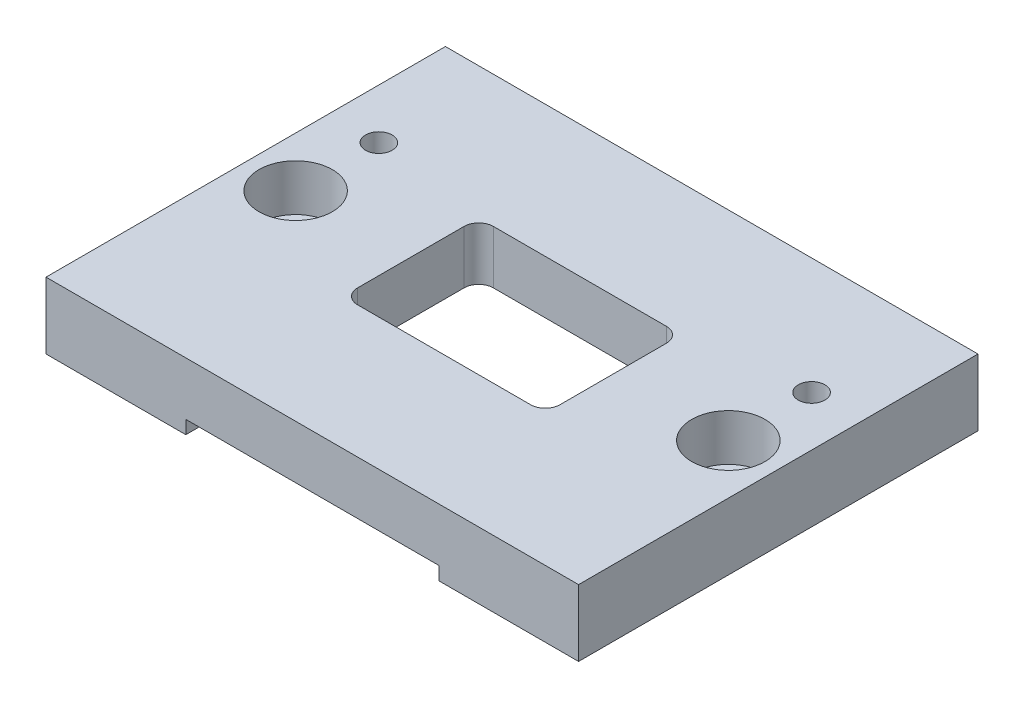
ISO-10303-21;
HEADER;
FILE_DESCRIPTION(('STEP AP214'),'2;1');
FILE_NAME('part.step','',(''),(''),'','','');
FILE_SCHEMA(('AUTOMOTIVE_DESIGN { 1 0 10303 214 1 1 1 1 }'));
ENDSEC;
DATA;
#1=APPLICATION_CONTEXT('core data for automotive mechanical design processes');
#2=APPLICATION_PROTOCOL_DEFINITION('international standard','automotive_design',2000,#1);
#3=PRODUCT_CONTEXT('',#1,'mechanical');
#4=PRODUCT('Part','Part','',(#3));
#5=PRODUCT_RELATED_PRODUCT_CATEGORY('part','',(#4));
#6=PRODUCT_DEFINITION_FORMATION('','',#4);
#7=PRODUCT_DEFINITION_CONTEXT('part definition',#1,'design');
#8=PRODUCT_DEFINITION('design','',#6,#7);
#9=PRODUCT_DEFINITION_SHAPE('','',#8);
#10=(LENGTH_UNIT() NAMED_UNIT(*) SI_UNIT(.MILLI.,.METRE.));
#11=(NAMED_UNIT(*) PLANE_ANGLE_UNIT() SI_UNIT($,.RADIAN.));
#12=(NAMED_UNIT(*) SI_UNIT($,.STERADIAN.) SOLID_ANGLE_UNIT());
#13=UNCERTAINTY_MEASURE_WITH_UNIT(LENGTH_MEASURE(1.E-05),#10,'distance_accuracy_value','');
#14=(GEOMETRIC_REPRESENTATION_CONTEXT(3) GLOBAL_UNCERTAINTY_ASSIGNED_CONTEXT((#13)) GLOBAL_UNIT_ASSIGNED_CONTEXT((#10,
#11,#12)) REPRESENTATION_CONTEXT('',''));
#15=CARTESIAN_POINT('',(0.,0.,0.));
#16=DIRECTION('',(0.,0.,1.));
#17=DIRECTION('',(1.,0.,0.));
#18=AXIS2_PLACEMENT_3D('',#15,#16,#17);
#19=CARTESIAN_POINT('',(0.,-10.,0.));
#20=DIRECTION('',(0.,-1.,0.));
#21=DIRECTION('',(0.,0.,-1.));
#22=AXIS2_PLACEMENT_3D('',#19,#20,#21);
#23=PLANE('',#22);
#24=CARTESIAN_POINT('',(2.45974826094539,-10.,-6.46295597357506));
#25=DIRECTION('',(0.,-1.,0.));
#26=DIRECTION('',(0.,0.,-1.));
#27=AXIS2_PLACEMENT_3D('',#24,#25,#26);
#28=CIRCLE('',#27,3.3);
#29=CARTESIAN_POINT('',(2.45974826094539,-10.,-3.16295597357506));
#30=VERTEX_POINT('',#29);
#31=EDGE_CURVE('E188',#30,#30,#28,.T.);
#32=ORIENTED_EDGE('',*,*,#31,.F.);
#33=EDGE_LOOP('',(#32));
#34=FACE_BOUND('',#33,.T.);
#35=DIRECTION('',(0.,0.,1.));
#36=VECTOR('',#35,1.);
#37=CARTESIAN_POINT('',(-11.0402517390546,-10.,-36.4629559735751));
#38=LINE('',#37,#36);
#39=CARTESIAN_POINT('',(-11.0402517390546,-10.,-36.4629559735751));
#40=VERTEX_POINT('',#39);
#41=CARTESIAN_POINT('',(-11.0402517390546,-10.,23.5370440264249));
#42=VERTEX_POINT('',#41);
#43=EDGE_CURVE('E197',#40,#42,#38,.T.);
#44=ORIENTED_EDGE('',*,*,#43,.F.);
#45=DIRECTION('',(1.,0.,0.));
#46=VECTOR('',#45,1.);
#47=CARTESIAN_POINT('',(-70.0402517390546,-10.,-36.4629559735751));
#48=LINE('',#47,#46);
#49=CARTESIAN_POINT('',(9.95974826094539,-10.,-36.4629559735751));
#50=VERTEX_POINT('',#49);
#51=EDGE_CURVE('E181',#40,#50,#48,.T.);
#52=ORIENTED_EDGE('',*,*,#51,.T.);
#53=DIRECTION('',(0.,0.,1.));
#54=VECTOR('',#53,1.);
#55=CARTESIAN_POINT('',(9.95974826094539,-10.,-36.4629559735751));
#56=LINE('',#55,#54);
#57=CARTESIAN_POINT('',(9.95974826094539,-10.,23.5370440264249));
#58=VERTEX_POINT('',#57);
#59=EDGE_CURVE('E325',#50,#58,#56,.T.);
#60=ORIENTED_EDGE('',*,*,#59,.T.);
#61=DIRECTION('',(-1.,0.,0.));
#62=VECTOR('',#61,1.);
#63=CARTESIAN_POINT('',(9.95974826094539,-10.,23.5370440264249));
#64=LINE('',#63,#62);
#65=EDGE_CURVE('E329',#58,#42,#64,.T.);
#66=ORIENTED_EDGE('',*,*,#65,.T.);
#67=EDGE_LOOP('',(#44,#52,#60,#66));
#68=FACE_BOUND('',#67,.T.);
#69=CARTESIAN_POINT('',(2.4597482609454,-10.,-18.9629559735751));
#70=DIRECTION('',(0.,1.,0.));
#71=DIRECTION('',(0.,0.,1.));
#72=AXIS2_PLACEMENT_3D('',#69,#70,#71);
#73=CIRCLE('',#72,2.);
#74=CARTESIAN_POINT('',(2.4597482609454,-10.,-16.9629559735751));
#75=VERTEX_POINT('',#74);
#76=EDGE_CURVE('E293',#75,#75,#73,.T.);
#77=ORIENTED_EDGE('',*,*,#76,.T.);
#78=EDGE_LOOP('',(#77));
#79=FACE_BOUND('',#78,.T.);
#80=ADVANCED_FACE('F39',(#34,#68,#79),#23,.T.);
#81=CARTESIAN_POINT('',(-70.0402517390546,-10.,23.5370440264249));
#82=DIRECTION('',(1.,0.,0.));
#83=DIRECTION('',(0.,0.,-1.));
#84=AXIS2_PLACEMENT_3D('',#81,#82,#83);
#85=PLANE('',#84);
#86=DIRECTION('',(0.,0.,-1.));
#87=VECTOR('',#86,1.);
#88=CARTESIAN_POINT('',(-70.0402517390546,0.,23.5370440264249));
#89=LINE('',#88,#87);
#90=CARTESIAN_POINT('',(-70.0402517390546,0.,23.5370440264249));
#91=VERTEX_POINT('',#90);
#92=CARTESIAN_POINT('',(-70.0402517390546,0.,-36.4629559735751));
#93=VERTEX_POINT('',#92);
#94=EDGE_CURVE('E304',#91,#93,#89,.T.);
#95=ORIENTED_EDGE('',*,*,#94,.T.);
#96=DIRECTION('',(0.,1.,0.));
#97=VECTOR('',#96,1.);
#98=CARTESIAN_POINT('',(-70.0402517390546,-10.,-36.4629559735751));
#99=LINE('',#98,#97);
#100=CARTESIAN_POINT('',(-70.0402517390546,-10.,-36.4629559735751));
#101=VERTEX_POINT('',#100);
#102=EDGE_CURVE('E11',#101,#93,#99,.T.);
#103=ORIENTED_EDGE('',*,*,#102,.F.);
#104=DIRECTION('',(0.,0.,-1.));
#105=VECTOR('',#104,1.);
#106=CARTESIAN_POINT('',(-70.0402517390546,-10.,23.5370440264249));
#107=LINE('',#106,#105);
#108=CARTESIAN_POINT('',(-70.0402517390546,-10.,23.5370440264249));
#109=VERTEX_POINT('',#108);
#110=EDGE_CURVE('E316',#109,#101,#107,.T.);
#111=ORIENTED_EDGE('',*,*,#110,.F.);
#112=DIRECTION('',(0.,1.,0.));
#113=VECTOR('',#112,1.);
#114=CARTESIAN_POINT('',(-70.0402517390546,-10.,23.5370440264249));
#115=LINE('',#114,#113);
#116=EDGE_CURVE('E333',#109,#91,#115,.T.);
#117=ORIENTED_EDGE('',*,*,#116,.T.);
#118=EDGE_LOOP('',(#95,#103,#111,#117));
#119=FACE_BOUND('',#118,.T.);
#120=ADVANCED_FACE('F41',(#119),#85,.F.);
#121=CARTESIAN_POINT('',(-70.0402517390546,-10.,-36.4629559735751));
#122=DIRECTION('',(0.,0.,1.));
#123=DIRECTION('',(1.,0.,0.));
#124=AXIS2_PLACEMENT_3D('',#121,#122,#123);
#125=PLANE('',#124);
#126=ORIENTED_EDGE('',*,*,#51,.F.);
#127=DIRECTION('',(0.,1.,0.));
#128=VECTOR('',#127,1.);
#129=CARTESIAN_POINT('',(-11.0402517390546,-8.,-36.4629559735751));
#130=LINE('',#129,#128);
#131=CARTESIAN_POINT('',(-11.0402517390546,-8.,-36.4629559735751));
#132=VERTEX_POINT('',#131);
#133=EDGE_CURVE('E159',#40,#132,#130,.T.);
#134=ORIENTED_EDGE('',*,*,#133,.T.);
#135=DIRECTION('',(-1.,0.,0.));
#136=VECTOR('',#135,1.);
#137=CARTESIAN_POINT('',(-49.0402517390546,-8.,-36.4629559735751));
#138=LINE('',#137,#136);
#139=CARTESIAN_POINT('',(-49.0402517390546,-8.,-36.4629559735751));
#140=VERTEX_POINT('',#139);
#141=EDGE_CURVE('E171',#132,#140,#138,.T.);
#142=ORIENTED_EDGE('',*,*,#141,.T.);
#143=DIRECTION('',(0.,-1.,0.));
#144=VECTOR('',#143,1.);
#145=CARTESIAN_POINT('',(-49.0402517390546,-10.,-36.4629559735751));
#146=LINE('',#145,#144);
#147=CARTESIAN_POINT('',(-49.0402517390546,-10.,-36.4629559735751));
#148=VERTEX_POINT('',#147);
#149=EDGE_CURVE('E168',#140,#148,#146,.T.);
#150=ORIENTED_EDGE('',*,*,#149,.T.);
#151=EDGE_CURVE('E321',#101,#148,#48,.T.);
#152=ORIENTED_EDGE('',*,*,#151,.F.);
#153=ORIENTED_EDGE('',*,*,#102,.T.);
#154=DIRECTION('',(1.,0.,0.));
#155=VECTOR('',#154,1.);
#156=CARTESIAN_POINT('',(-70.0402517390546,0.,-36.4629559735751));
#157=LINE('',#156,#155);
#158=CARTESIAN_POINT('',(9.95974826094539,0.,-36.4629559735751));
#159=VERTEX_POINT('',#158);
#160=EDGE_CURVE('E337',#93,#159,#157,.T.);
#161=ORIENTED_EDGE('',*,*,#160,.T.);
#162=DIRECTION('',(0.,1.,0.));
#163=VECTOR('',#162,1.);
#164=CARTESIAN_POINT('',(9.95974826094539,-10.,-36.4629559735751));
#165=LINE('',#164,#163);
#166=EDGE_CURVE('E49',#50,#159,#165,.T.);
#167=ORIENTED_EDGE('',*,*,#166,.F.);
#168=EDGE_LOOP('',(#126,#134,#142,#150,#152,#153,#161,#167));
#169=FACE_BOUND('',#168,.T.);
#170=ADVANCED_FACE('F179',(#169),#125,.F.);
#171=CARTESIAN_POINT('',(9.95974826094539,-10.,-36.4629559735751));
#172=DIRECTION('',(-1.,0.,0.));
#173=DIRECTION('',(0.,0.,1.));
#174=AXIS2_PLACEMENT_3D('',#171,#172,#173);
#175=PLANE('',#174);
#176=DIRECTION('',(0.,0.,1.));
#177=VECTOR('',#176,1.);
#178=CARTESIAN_POINT('',(9.95974826094539,0.,-36.4629559735751));
#179=LINE('',#178,#177);
#180=CARTESIAN_POINT('',(9.95974826094539,0.,23.5370440264249));
#181=VERTEX_POINT('',#180);
#182=EDGE_CURVE('E340',#159,#181,#179,.T.);
#183=ORIENTED_EDGE('',*,*,#182,.T.);
#184=DIRECTION('',(0.,1.,0.));
#185=VECTOR('',#184,1.);
#186=CARTESIAN_POINT('',(9.95974826094539,-10.,23.5370440264249));
#187=LINE('',#186,#185);
#188=EDGE_CURVE('E348',#58,#181,#187,.T.);
#189=ORIENTED_EDGE('',*,*,#188,.F.);
#190=ORIENTED_EDGE('',*,*,#59,.F.);
#191=ORIENTED_EDGE('',*,*,#166,.T.);
#192=EDGE_LOOP('',(#183,#189,#190,#191));
#193=FACE_BOUND('',#192,.T.);
#194=ADVANCED_FACE('F413',(#193),#175,.F.);
#195=CARTESIAN_POINT('',(9.95974826094539,-10.,23.5370440264249));
#196=DIRECTION('',(0.,0.,-1.));
#197=DIRECTION('',(-1.,0.,0.));
#198=AXIS2_PLACEMENT_3D('',#195,#196,#197);
#199=PLANE('',#198);
#200=DIRECTION('',(-1.,0.,0.));
#201=VECTOR('',#200,1.);
#202=CARTESIAN_POINT('',(-49.0402517390546,-8.,23.5370440264249));
#203=LINE('',#202,#201);
#204=CARTESIAN_POINT('',(-11.0402517390546,-8.,23.5370440264249));
#205=VERTEX_POINT('',#204);
#206=CARTESIAN_POINT('',(-49.0402517390546,-8.,23.5370440264249));
#207=VERTEX_POINT('',#206);
#208=EDGE_CURVE('E185',#205,#207,#203,.T.);
#209=ORIENTED_EDGE('',*,*,#208,.F.);
#210=DIRECTION('',(0.,1.,0.));
#211=VECTOR('',#210,1.);
#212=CARTESIAN_POINT('',(-11.0402517390546,-8.,23.5370440264249));
#213=LINE('',#212,#211);
#214=EDGE_CURVE('E162',#42,#205,#213,.T.);
#215=ORIENTED_EDGE('',*,*,#214,.F.);
#216=ORIENTED_EDGE('',*,*,#65,.F.);
#217=ORIENTED_EDGE('',*,*,#188,.T.);
#218=DIRECTION('',(-1.,0.,0.));
#219=VECTOR('',#218,1.);
#220=CARTESIAN_POINT('',(9.95974826094539,0.,23.5370440264249));
#221=LINE('',#220,#219);
#222=EDGE_CURVE('E320',#181,#91,#221,.T.);
#223=ORIENTED_EDGE('',*,*,#222,.T.);
#224=ORIENTED_EDGE('',*,*,#116,.F.);
#225=CARTESIAN_POINT('',(-49.0402517390546,-10.,23.5370440264249));
#226=VERTEX_POINT('',#225);
#227=EDGE_CURVE('E328',#226,#109,#64,.T.);
#228=ORIENTED_EDGE('',*,*,#227,.F.);
#229=DIRECTION('',(0.,-1.,0.));
#230=VECTOR('',#229,1.);
#231=CARTESIAN_POINT('',(-49.0402517390546,-10.,23.5370440264249));
#232=LINE('',#231,#230);
#233=EDGE_CURVE('E57',#207,#226,#232,.T.);
#234=ORIENTED_EDGE('',*,*,#233,.F.);
#235=EDGE_LOOP('',(#209,#215,#216,#217,#223,#224,#228,#234));
#236=FACE_BOUND('',#235,.T.);
#237=ADVANCED_FACE('F408',(#236),#199,.F.);
#238=CARTESIAN_POINT('',(-62.5402517390546,-10.,-6.46295597357506));
#239=DIRECTION('',(0.,-1.,0.));
#240=DIRECTION('',(0.,0.,-1.));
#241=AXIS2_PLACEMENT_3D('',#238,#239,#240);
#242=CIRCLE('',#241,3.3);
#243=CARTESIAN_POINT('',(-62.5402517390546,-10.,-3.16295597357506));
#244=VERTEX_POINT('',#243);
#245=EDGE_CURVE('E357',#244,#244,#242,.T.);
#246=ORIENTED_EDGE('',*,*,#245,.F.);
#247=EDGE_LOOP('',(#246));
#248=FACE_BOUND('',#247,.T.);
#249=DIRECTION('',(0.,0.,1.));
#250=VECTOR('',#249,1.);
#251=CARTESIAN_POINT('',(-49.0402517390546,-10.,-36.4629559735751));
#252=LINE('',#251,#250);
#253=EDGE_CURVE('E200',#148,#226,#252,.T.);
#254=ORIENTED_EDGE('',*,*,#253,.T.);
#255=ORIENTED_EDGE('',*,*,#227,.T.);
#256=ORIENTED_EDGE('',*,*,#110,.T.);
#257=ORIENTED_EDGE('',*,*,#151,.T.);
#258=EDGE_LOOP('',(#254,#255,#256,#257));
#259=FACE_BOUND('',#258,.T.);
#260=CARTESIAN_POINT('',(-62.5402517390546,-10.,-18.9629559735751));
#261=DIRECTION('',(0.,1.,0.));
#262=DIRECTION('',(0.,0.,1.));
#263=AXIS2_PLACEMENT_3D('',#260,#261,#262);
#264=CIRCLE('',#263,2.);
#265=CARTESIAN_POINT('',(-62.5402517390546,-10.,-16.9629559735751));
#266=VERTEX_POINT('',#265);
#267=EDGE_CURVE('E284',#266,#266,#264,.T.);
#268=ORIENTED_EDGE('',*,*,#267,.T.);
#269=EDGE_LOOP('',(#268));
#270=FACE_BOUND('',#269,.T.);
#271=ADVANCED_FACE('F377',(#248,#259,#270),#23,.T.);
#272=CARTESIAN_POINT('',(0.,0.,0.));
#273=DIRECTION('',(0.,-1.,0.));
#274=DIRECTION('',(0.,0.,-1.));
#275=AXIS2_PLACEMENT_3D('',#272,#273,#274);
#276=PLANE('',#275);
#277=DIRECTION('',(1.,0.,0.));
#278=VECTOR('',#277,1.);
#279=CARTESIAN_POINT('',(-17.0402517390546,0.,3.73704402642494));
#280=LINE('',#279,#278);
#281=CARTESIAN_POINT('',(-43.0402517390546,0.,3.73704402642494));
#282=VERTEX_POINT('',#281);
#283=CARTESIAN_POINT('',(-17.0402517390546,0.,3.73704402642494));
#284=VERTEX_POINT('',#283);
#285=EDGE_CURVE('E233',#282,#284,#280,.T.);
#286=ORIENTED_EDGE('',*,*,#285,.F.);
#287=CARTESIAN_POINT('',(-43.0402517390546,0.,1.53704402642494));
#288=DIRECTION('',(0.,1.,0.));
#289=DIRECTION('',(0.,0.,-1.));
#290=AXIS2_PLACEMENT_3D('',#287,#288,#289);
#291=CIRCLE('',#290,2.2);
#292=CARTESIAN_POINT('',(-45.2402517390546,0.,1.53704402642492));
#293=VERTEX_POINT('',#292);
#294=EDGE_CURVE('E65',#293,#282,#291,.T.);
#295=ORIENTED_EDGE('',*,*,#294,.F.);
#296=DIRECTION('',(0.,0.,1.));
#297=VECTOR('',#296,1.);
#298=CARTESIAN_POINT('',(-45.2402517390546,0.,1.53704402642492));
#299=LINE('',#298,#297);
#300=CARTESIAN_POINT('',(-45.2402517390546,0.,-14.462955973575));
#301=VERTEX_POINT('',#300);
#302=EDGE_CURVE('E209',#301,#293,#299,.T.);
#303=ORIENTED_EDGE('',*,*,#302,.F.);
#304=CARTESIAN_POINT('',(-43.0402517390546,0.,-14.4629559735751));
#305=DIRECTION('',(0.,1.,0.));
#306=DIRECTION('',(0.,0.,-1.));
#307=AXIS2_PLACEMENT_3D('',#304,#305,#306);
#308=CIRCLE('',#307,2.2);
#309=CARTESIAN_POINT('',(-43.0402517390546,0.,-16.6629559735751));
#310=VERTEX_POINT('',#309);
#311=EDGE_CURVE('E253',#310,#301,#308,.T.);
#312=ORIENTED_EDGE('',*,*,#311,.F.);
#313=DIRECTION('',(-1.,0.,0.));
#314=VECTOR('',#313,1.);
#315=CARTESIAN_POINT('',(-43.0402517390546,0.,-16.6629559735751));
#316=LINE('',#315,#314);
#317=CARTESIAN_POINT('',(-17.0402517390546,0.,-16.6629559735751));
#318=VERTEX_POINT('',#317);
#319=EDGE_CURVE('E249',#318,#310,#316,.T.);
#320=ORIENTED_EDGE('',*,*,#319,.F.);
#321=CARTESIAN_POINT('',(-17.0402517390546,0.,-14.4629559735751));
#322=DIRECTION('',(0.,1.,0.));
#323=DIRECTION('',(0.,0.,-1.));
#324=AXIS2_PLACEMENT_3D('',#321,#322,#323);
#325=CIRCLE('',#324,2.2);
#326=CARTESIAN_POINT('',(-14.8402517390546,0.,-14.462955973575));
#327=VERTEX_POINT('',#326);
#328=EDGE_CURVE('E245',#327,#318,#325,.T.);
#329=ORIENTED_EDGE('',*,*,#328,.F.);
#330=DIRECTION('',(0.,0.,-1.));
#331=VECTOR('',#330,1.);
#332=CARTESIAN_POINT('',(-14.8402517390546,0.,-14.462955973575));
#333=LINE('',#332,#331);
#334=CARTESIAN_POINT('',(-14.8402517390546,0.,1.53704402642492));
#335=VERTEX_POINT('',#334);
#336=EDGE_CURVE('E241',#335,#327,#333,.T.);
#337=ORIENTED_EDGE('',*,*,#336,.F.);
#338=CARTESIAN_POINT('',(-17.0402517390546,0.,1.53704402642494));
#339=DIRECTION('',(0.,1.,0.));
#340=DIRECTION('',(0.,0.,-1.));
#341=AXIS2_PLACEMENT_3D('',#338,#339,#340);
#342=CIRCLE('',#341,2.2);
#343=EDGE_CURVE('E237',#284,#335,#342,.T.);
#344=ORIENTED_EDGE('',*,*,#343,.F.);
#345=EDGE_LOOP('',(#286,#295,#303,#312,#320,#329,#337,#344));
#346=FACE_BOUND('',#345,.T.);
#347=CARTESIAN_POINT('',(-62.5402517390546,0.,-18.9629559735751));
#348=DIRECTION('',(0.,1.,0.));
#349=DIRECTION('',(0.,0.,1.));
#350=AXIS2_PLACEMENT_3D('',#347,#348,#349);
#351=CIRCLE('',#350,2.);
#352=CARTESIAN_POINT('',(-62.5402517390546,0.,-16.9629559735751));
#353=VERTEX_POINT('',#352);
#354=EDGE_CURVE('E289',#353,#353,#351,.T.);
#355=ORIENTED_EDGE('',*,*,#354,.F.);
#356=EDGE_LOOP('',(#355));
#357=FACE_BOUND('',#356,.T.);
#358=CARTESIAN_POINT('',(2.4597482609454,0.,-18.9629559735751));
#359=DIRECTION('',(0.,1.,0.));
#360=DIRECTION('',(0.,0.,1.));
#361=AXIS2_PLACEMENT_3D('',#358,#359,#360);
#362=CIRCLE('',#361,2.);
#363=CARTESIAN_POINT('',(2.4597482609454,0.,-16.9629559735751));
#364=VERTEX_POINT('',#363);
#365=EDGE_CURVE('E263',#364,#364,#362,.T.);
#366=ORIENTED_EDGE('',*,*,#365,.F.);
#367=EDGE_LOOP('',(#366));
#368=FACE_BOUND('',#367,.T.);
#369=CARTESIAN_POINT('',(-62.5402517390546,0.,-6.46295597357506));
#370=DIRECTION('',(0.,1.,0.));
#371=DIRECTION('',(0.,0.,1.));
#372=AXIS2_PLACEMENT_3D('',#369,#370,#371);
#373=CIRCLE('',#372,5.5);
#374=CARTESIAN_POINT('',(-62.5402517390546,0.,-0.962955973575064));
#375=VERTEX_POINT('',#374);
#376=EDGE_CURVE('E305',#375,#375,#373,.T.);
#377=ORIENTED_EDGE('',*,*,#376,.F.);
#378=EDGE_LOOP('',(#377));
#379=FACE_BOUND('',#378,.T.);
#380=CARTESIAN_POINT('',(2.45974826094539,0.,-6.46295597357506));
#381=DIRECTION('',(0.,1.,0.));
#382=DIRECTION('',(0.,0.,1.));
#383=AXIS2_PLACEMENT_3D('',#380,#381,#382);
#384=CIRCLE('',#383,5.5);
#385=CARTESIAN_POINT('',(2.45974826094539,0.,-0.962955973575061));
#386=VERTEX_POINT('',#385);
#387=EDGE_CURVE('E288',#386,#386,#384,.T.);
#388=ORIENTED_EDGE('',*,*,#387,.F.);
#389=EDGE_LOOP('',(#388));
#390=FACE_BOUND('',#389,.T.);
#391=ORIENTED_EDGE('',*,*,#94,.F.);
#392=ORIENTED_EDGE('',*,*,#222,.F.);
#393=ORIENTED_EDGE('',*,*,#182,.F.);
#394=ORIENTED_EDGE('',*,*,#160,.F.);
#395=EDGE_LOOP('',(#391,#392,#393,#394));
#396=FACE_BOUND('',#395,.T.);
#397=ADVANCED_FACE('F389',(#346,#357,#368,#379,#390,#396),#276,.F.);
#398=CARTESIAN_POINT('',(2.45974826094539,-7.,-6.46295597357506));
#399=DIRECTION('',(0.,1.,0.));
#400=DIRECTION('',(0.,0.,1.));
#401=AXIS2_PLACEMENT_3D('',#398,#399,#400);
#402=CYLINDRICAL_SURFACE('',#401,5.5);
#403=CARTESIAN_POINT('',(2.45974826094539,-7.,-6.46295597357506));
#404=DIRECTION('',(0.,1.,0.));
#405=DIRECTION('',(0.,0.,1.));
#406=AXIS2_PLACEMENT_3D('',#403,#404,#405);
#407=CIRCLE('',#406,5.5);
#408=CARTESIAN_POINT('',(2.45974826094539,-7.,-0.962955973575061));
#409=VERTEX_POINT('',#408);
#410=EDGE_CURVE('E309',#409,#409,#407,.T.);
#411=ORIENTED_EDGE('',*,*,#410,.F.);
#412=EDGE_LOOP('',(#411));
#413=FACE_BOUND('',#412,.T.);
#414=ORIENTED_EDGE('',*,*,#387,.T.);
#415=EDGE_LOOP('',(#414));
#416=FACE_BOUND('',#415,.T.);
#417=ADVANCED_FACE('F392',(#413,#416),#402,.F.);
#418=CARTESIAN_POINT('',(2.45974826094539,-7.,-6.46295597357506));
#419=DIRECTION('',(0.,1.,0.));
#420=DIRECTION('',(0.,0.,1.));
#421=AXIS2_PLACEMENT_3D('',#418,#419,#420);
#422=PLANE('',#421);
#423=CARTESIAN_POINT('',(2.45974826094539,-7.,-6.46295597357506));
#424=DIRECTION('',(0.,1.,0.));
#425=DIRECTION('',(0.,0.,1.));
#426=AXIS2_PLACEMENT_3D('',#423,#424,#425);
#427=CIRCLE('',#426,3.3);
#428=CARTESIAN_POINT('',(2.45974826094539,-7.,-3.16295597357506));
#429=VERTEX_POINT('',#428);
#430=EDGE_CURVE('E43',#429,#429,#427,.T.);
#431=ORIENTED_EDGE('',*,*,#430,.F.);
#432=EDGE_LOOP('',(#431));
#433=FACE_BOUND('',#432,.T.);
#434=ORIENTED_EDGE('',*,*,#410,.T.);
#435=EDGE_LOOP('',(#434));
#436=FACE_BOUND('',#435,.T.);
#437=ADVANCED_FACE('F472',(#433,#436),#422,.T.);
#438=CARTESIAN_POINT('',(-62.5402517390546,-7.,-6.46295597357506));
#439=DIRECTION('',(0.,1.,0.));
#440=DIRECTION('',(0.,0.,1.));
#441=AXIS2_PLACEMENT_3D('',#438,#439,#440);
#442=CYLINDRICAL_SURFACE('',#441,5.5);
#443=CARTESIAN_POINT('',(-62.5402517390546,-7.,-6.46295597357506));
#444=DIRECTION('',(0.,1.,0.));
#445=DIRECTION('',(0.,0.,1.));
#446=AXIS2_PLACEMENT_3D('',#443,#444,#445);
#447=CIRCLE('',#446,5.5);
#448=CARTESIAN_POINT('',(-62.5402517390546,-7.,-0.962955973575064));
#449=VERTEX_POINT('',#448);
#450=EDGE_CURVE('E300',#449,#449,#447,.T.);
#451=ORIENTED_EDGE('',*,*,#450,.F.);
#452=EDGE_LOOP('',(#451));
#453=FACE_BOUND('',#452,.T.);
#454=ORIENTED_EDGE('',*,*,#376,.T.);
#455=EDGE_LOOP('',(#454));
#456=FACE_BOUND('',#455,.T.);
#457=ADVANCED_FACE('F468',(#453,#456),#442,.F.);
#458=CARTESIAN_POINT('',(-62.5402517390546,-7.,-6.46295597357506));
#459=DIRECTION('',(0.,1.,0.));
#460=DIRECTION('',(0.,0.,1.));
#461=AXIS2_PLACEMENT_3D('',#458,#459,#460);
#462=PLANE('',#461);
#463=CARTESIAN_POINT('',(-62.5402517390546,-7.,-6.46295597357506));
#464=DIRECTION('',(0.,1.,0.));
#465=DIRECTION('',(0.,0.,1.));
#466=AXIS2_PLACEMENT_3D('',#463,#464,#465);
#467=CIRCLE('',#466,3.3);
#468=CARTESIAN_POINT('',(-62.5402517390546,-7.,-3.16295597357506));
#469=VERTEX_POINT('',#468);
#470=EDGE_CURVE('E354',#469,#469,#467,.T.);
#471=ORIENTED_EDGE('',*,*,#470,.F.);
#472=EDGE_LOOP('',(#471));
#473=FACE_BOUND('',#472,.T.);
#474=ORIENTED_EDGE('',*,*,#450,.T.);
#475=EDGE_LOOP('',(#474));
#476=FACE_BOUND('',#475,.T.);
#477=ADVANCED_FACE('F385',(#473,#476),#462,.T.);
#478=CARTESIAN_POINT('',(2.4597482609454,-10.,-18.9629559735751));
#479=DIRECTION('',(0.,1.,0.));
#480=DIRECTION('',(0.,0.,1.));
#481=AXIS2_PLACEMENT_3D('',#478,#479,#480);
#482=CYLINDRICAL_SURFACE('',#481,2.);
#483=ORIENTED_EDGE('',*,*,#76,.F.);
#484=EDGE_LOOP('',(#483));
#485=FACE_BOUND('',#484,.T.);
#486=ORIENTED_EDGE('',*,*,#365,.T.);
#487=EDGE_LOOP('',(#486));
#488=FACE_BOUND('',#487,.T.);
#489=ADVANCED_FACE('F381',(#485,#488),#482,.F.);
#490=CARTESIAN_POINT('',(-62.5402517390546,-10.,-18.9629559735751));
#491=DIRECTION('',(0.,1.,0.));
#492=DIRECTION('',(0.,0.,1.));
#493=AXIS2_PLACEMENT_3D('',#490,#491,#492);
#494=CYLINDRICAL_SURFACE('',#493,2.);
#495=ORIENTED_EDGE('',*,*,#267,.F.);
#496=EDGE_LOOP('',(#495));
#497=FACE_BOUND('',#496,.T.);
#498=ORIENTED_EDGE('',*,*,#354,.T.);
#499=EDGE_LOOP('',(#498));
#500=FACE_BOUND('',#499,.T.);
#501=ADVANCED_FACE('F384',(#497,#500),#494,.F.);
#502=CARTESIAN_POINT('',(-43.0402517390546,-8.,1.53704402642494));
#503=DIRECTION('',(0.,1.,0.));
#504=DIRECTION('',(0.,0.,1.));
#505=AXIS2_PLACEMENT_3D('',#502,#503,#504);
#506=CYLINDRICAL_SURFACE('',#505,2.2);
#507=ORIENTED_EDGE('',*,*,#294,.T.);
#508=DIRECTION('',(0.,1.,0.));
#509=VECTOR('',#508,1.);
#510=CARTESIAN_POINT('',(-43.0402517390546,-8.,3.73704402642494));
#511=LINE('',#510,#509);
#512=CARTESIAN_POINT('',(-43.0402517390546,-8.,3.73704402642494));
#513=VERTEX_POINT('',#512);
#514=EDGE_CURVE('E230',#513,#282,#511,.T.);
#515=ORIENTED_EDGE('',*,*,#514,.F.);
#516=CARTESIAN_POINT('',(-43.0402517390546,-8.,1.53704402642494));
#517=DIRECTION('',(0.,1.,0.));
#518=DIRECTION('',(0.,0.,-1.));
#519=AXIS2_PLACEMENT_3D('',#516,#517,#518);
#520=CIRCLE('',#519,2.2);
#521=CARTESIAN_POINT('',(-45.2402517390546,-8.,1.53704402642492));
#522=VERTEX_POINT('',#521);
#523=EDGE_CURVE('E205',#522,#513,#520,.T.);
#524=ORIENTED_EDGE('',*,*,#523,.F.);
#525=DIRECTION('',(0.,1.,0.));
#526=VECTOR('',#525,1.);
#527=CARTESIAN_POINT('',(-45.2402517390546,-8.,1.53704402642492));
#528=LINE('',#527,#526);
#529=EDGE_CURVE('E260',#522,#293,#528,.T.);
#530=ORIENTED_EDGE('',*,*,#529,.T.);
#531=EDGE_LOOP('',(#507,#515,#524,#530));
#532=FACE_BOUND('',#531,.T.);
#533=ADVANCED_FACE('F437',(#532),#506,.F.);
#534=CARTESIAN_POINT('',(-45.2402517390546,-8.,1.53704402642492));
#535=DIRECTION('',(-1.,0.,0.));
#536=DIRECTION('',(0.,0.,1.));
#537=AXIS2_PLACEMENT_3D('',#534,#535,#536);
#538=PLANE('',#537);
#539=ORIENTED_EDGE('',*,*,#302,.T.);
#540=ORIENTED_EDGE('',*,*,#529,.F.);
#541=DIRECTION('',(0.,0.,1.));
#542=VECTOR('',#541,1.);
#543=CARTESIAN_POINT('',(-45.2402517390546,-8.,1.53704402642492));
#544=LINE('',#543,#542);
#545=CARTESIAN_POINT('',(-45.2402517390546,-8.,-14.462955973575));
#546=VERTEX_POINT('',#545);
#547=EDGE_CURVE('E227',#546,#522,#544,.T.);
#548=ORIENTED_EDGE('',*,*,#547,.F.);
#549=DIRECTION('',(0.,1.,0.));
#550=VECTOR('',#549,1.);
#551=CARTESIAN_POINT('',(-45.2402517390546,-8.,-14.462955973575));
#552=LINE('',#551,#550);
#553=EDGE_CURVE('E264',#546,#301,#552,.T.);
#554=ORIENTED_EDGE('',*,*,#553,.T.);
#555=EDGE_LOOP('',(#539,#540,#548,#554));
#556=FACE_BOUND('',#555,.T.);
#557=ADVANCED_FACE('F433',(#556),#538,.F.);
#558=CARTESIAN_POINT('',(-43.0402517390546,-8.,-14.4629559735751));
#559=DIRECTION('',(0.,1.,0.));
#560=DIRECTION('',(0.,0.,1.));
#561=AXIS2_PLACEMENT_3D('',#558,#559,#560);
#562=CYLINDRICAL_SURFACE('',#561,2.2);
#563=ORIENTED_EDGE('',*,*,#311,.T.);
#564=ORIENTED_EDGE('',*,*,#553,.F.);
#565=CARTESIAN_POINT('',(-43.0402517390546,-8.,-14.4629559735751));
#566=DIRECTION('',(0.,1.,0.));
#567=DIRECTION('',(0.,0.,-1.));
#568=AXIS2_PLACEMENT_3D('',#565,#566,#567);
#569=CIRCLE('',#568,2.2);
#570=CARTESIAN_POINT('',(-43.0402517390546,-8.,-16.6629559735751));
#571=VERTEX_POINT('',#570);
#572=EDGE_CURVE('E224',#571,#546,#569,.T.);
#573=ORIENTED_EDGE('',*,*,#572,.F.);
#574=DIRECTION('',(0.,1.,0.));
#575=VECTOR('',#574,1.);
#576=CARTESIAN_POINT('',(-43.0402517390546,-8.,-16.6629559735751));
#577=LINE('',#576,#575);
#578=EDGE_CURVE('E267',#571,#310,#577,.T.);
#579=ORIENTED_EDGE('',*,*,#578,.T.);
#580=EDGE_LOOP('',(#563,#564,#573,#579));
#581=FACE_BOUND('',#580,.T.);
#582=ADVANCED_FACE('F436',(#581),#562,.F.);
#583=CARTESIAN_POINT('',(-43.0402517390546,-8.,-16.6629559735751));
#584=DIRECTION('',(0.,0.,-1.));
#585=DIRECTION('',(-1.,0.,0.));
#586=AXIS2_PLACEMENT_3D('',#583,#584,#585);
#587=PLANE('',#586);
#588=ORIENTED_EDGE('',*,*,#319,.T.);
#589=ORIENTED_EDGE('',*,*,#578,.F.);
#590=DIRECTION('',(-1.,0.,0.));
#591=VECTOR('',#590,1.);
#592=CARTESIAN_POINT('',(-43.0402517390546,-8.,-16.6629559735751));
#593=LINE('',#592,#591);
#594=CARTESIAN_POINT('',(-17.0402517390546,-8.,-16.6629559735751));
#595=VERTEX_POINT('',#594);
#596=EDGE_CURVE('E221',#595,#571,#593,.T.);
#597=ORIENTED_EDGE('',*,*,#596,.F.);
#598=DIRECTION('',(0.,1.,0.));
#599=VECTOR('',#598,1.);
#600=CARTESIAN_POINT('',(-17.0402517390546,-8.,-16.6629559735751));
#601=LINE('',#600,#599);
#602=EDGE_CURVE('E270',#595,#318,#601,.T.);
#603=ORIENTED_EDGE('',*,*,#602,.T.);
#604=EDGE_LOOP('',(#588,#589,#597,#603));
#605=FACE_BOUND('',#604,.T.);
#606=ADVANCED_FACE('F441',(#605),#587,.F.);
#607=CARTESIAN_POINT('',(-17.0402517390546,-8.,-14.4629559735751));
#608=DIRECTION('',(0.,1.,0.));
#609=DIRECTION('',(0.,0.,1.));
#610=AXIS2_PLACEMENT_3D('',#607,#608,#609);
#611=CYLINDRICAL_SURFACE('',#610,2.2);
#612=ORIENTED_EDGE('',*,*,#328,.T.);
#613=ORIENTED_EDGE('',*,*,#602,.F.);
#614=CARTESIAN_POINT('',(-17.0402517390546,-8.,-14.4629559735751));
#615=DIRECTION('',(0.,1.,0.));
#616=DIRECTION('',(0.,0.,-1.));
#617=AXIS2_PLACEMENT_3D('',#614,#615,#616);
#618=CIRCLE('',#617,2.2);
#619=CARTESIAN_POINT('',(-14.8402517390546,-8.,-14.462955973575));
#620=VERTEX_POINT('',#619);
#621=EDGE_CURVE('E218',#620,#595,#618,.T.);
#622=ORIENTED_EDGE('',*,*,#621,.F.);
#623=DIRECTION('',(0.,1.,0.));
#624=VECTOR('',#623,1.);
#625=CARTESIAN_POINT('',(-14.8402517390546,-8.,-14.462955973575));
#626=LINE('',#625,#624);
#627=EDGE_CURVE('E273',#620,#327,#626,.T.);
#628=ORIENTED_EDGE('',*,*,#627,.T.);
#629=EDGE_LOOP('',(#612,#613,#622,#628));
#630=FACE_BOUND('',#629,.T.);
#631=ADVANCED_FACE('F445',(#630),#611,.F.);
#632=CARTESIAN_POINT('',(-14.8402517390546,-8.,-14.462955973575));
#633=DIRECTION('',(1.,0.,0.));
#634=DIRECTION('',(0.,0.,-1.));
#635=AXIS2_PLACEMENT_3D('',#632,#633,#634);
#636=PLANE('',#635);
#637=ORIENTED_EDGE('',*,*,#336,.T.);
#638=ORIENTED_EDGE('',*,*,#627,.F.);
#639=DIRECTION('',(0.,0.,-1.));
#640=VECTOR('',#639,1.);
#641=CARTESIAN_POINT('',(-14.8402517390546,-8.,-14.462955973575));
#642=LINE('',#641,#640);
#643=CARTESIAN_POINT('',(-14.8402517390546,-8.,1.53704402642492));
#644=VERTEX_POINT('',#643);
#645=EDGE_CURVE('E215',#644,#620,#642,.T.);
#646=ORIENTED_EDGE('',*,*,#645,.F.);
#647=DIRECTION('',(0.,1.,0.));
#648=VECTOR('',#647,1.);
#649=CARTESIAN_POINT('',(-14.8402517390546,-8.,1.53704402642492));
#650=LINE('',#649,#648);
#651=EDGE_CURVE('E276',#644,#335,#650,.T.);
#652=ORIENTED_EDGE('',*,*,#651,.T.);
#653=EDGE_LOOP('',(#637,#638,#646,#652));
#654=FACE_BOUND('',#653,.T.);
#655=ADVANCED_FACE('F449',(#654),#636,.F.);
#656=CARTESIAN_POINT('',(-17.0402517390546,-8.,1.53704402642494));
#657=DIRECTION('',(0.,1.,0.));
#658=DIRECTION('',(0.,0.,1.));
#659=AXIS2_PLACEMENT_3D('',#656,#657,#658);
#660=CYLINDRICAL_SURFACE('',#659,2.2);
#661=ORIENTED_EDGE('',*,*,#343,.T.);
#662=ORIENTED_EDGE('',*,*,#651,.F.);
#663=CARTESIAN_POINT('',(-17.0402517390546,-8.,1.53704402642494));
#664=DIRECTION('',(0.,1.,0.));
#665=DIRECTION('',(0.,0.,-1.));
#666=AXIS2_PLACEMENT_3D('',#663,#664,#665);
#667=CIRCLE('',#666,2.2);
#668=CARTESIAN_POINT('',(-17.0402517390546,-8.,3.73704402642494));
#669=VERTEX_POINT('',#668);
#670=EDGE_CURVE('E212',#669,#644,#667,.T.);
#671=ORIENTED_EDGE('',*,*,#670,.F.);
#672=DIRECTION('',(0.,1.,0.));
#673=VECTOR('',#672,1.);
#674=CARTESIAN_POINT('',(-17.0402517390546,-8.,3.73704402642494));
#675=LINE('',#674,#673);
#676=EDGE_CURVE('E279',#669,#284,#675,.T.);
#677=ORIENTED_EDGE('',*,*,#676,.T.);
#678=EDGE_LOOP('',(#661,#662,#671,#677));
#679=FACE_BOUND('',#678,.T.);
#680=ADVANCED_FACE('F453',(#679),#660,.F.);
#681=CARTESIAN_POINT('',(-17.0402517390546,-8.,3.73704402642494));
#682=DIRECTION('',(0.,0.,1.));
#683=DIRECTION('',(1.,0.,0.));
#684=AXIS2_PLACEMENT_3D('',#681,#682,#683);
#685=PLANE('',#684);
#686=ORIENTED_EDGE('',*,*,#285,.T.);
#687=ORIENTED_EDGE('',*,*,#676,.F.);
#688=DIRECTION('',(1.,0.,0.));
#689=VECTOR('',#688,1.);
#690=CARTESIAN_POINT('',(-17.0402517390546,-8.,3.73704402642494));
#691=LINE('',#690,#689);
#692=EDGE_CURVE('E208',#513,#669,#691,.T.);
#693=ORIENTED_EDGE('',*,*,#692,.F.);
#694=ORIENTED_EDGE('',*,*,#514,.T.);
#695=EDGE_LOOP('',(#686,#687,#693,#694));
#696=FACE_BOUND('',#695,.T.);
#697=ADVANCED_FACE('F428',(#696),#685,.F.);
#698=CARTESIAN_POINT('',(-11.0402517390546,-8.,-36.4629559735751));
#699=DIRECTION('',(1.,0.,0.));
#700=DIRECTION('',(0.,0.,-1.));
#701=AXIS2_PLACEMENT_3D('',#698,#699,#700);
#702=PLANE('',#701);
#703=ORIENTED_EDGE('',*,*,#214,.T.);
#704=DIRECTION('',(0.,0.,1.));
#705=VECTOR('',#704,1.);
#706=CARTESIAN_POINT('',(-11.0402517390546,-8.,-36.4629559735751));
#707=LINE('',#706,#705);
#708=EDGE_CURVE('E155',#132,#205,#707,.T.);
#709=ORIENTED_EDGE('',*,*,#708,.F.);
#710=ORIENTED_EDGE('',*,*,#133,.F.);
#711=ORIENTED_EDGE('',*,*,#43,.T.);
#712=EDGE_LOOP('',(#703,#709,#710,#711));
#713=FACE_BOUND('',#712,.T.);
#714=ADVANCED_FACE('F157',(#713),#702,.F.);
#715=CARTESIAN_POINT('',(-49.0402517390546,-10.,-36.4629559735751));
#716=DIRECTION('',(-1.,0.,0.));
#717=DIRECTION('',(0.,0.,1.));
#718=AXIS2_PLACEMENT_3D('',#715,#716,#717);
#719=PLANE('',#718);
#720=ORIENTED_EDGE('',*,*,#233,.T.);
#721=ORIENTED_EDGE('',*,*,#253,.F.);
#722=ORIENTED_EDGE('',*,*,#149,.F.);
#723=DIRECTION('',(0.,0.,1.));
#724=VECTOR('',#723,1.);
#725=CARTESIAN_POINT('',(-49.0402517390546,-8.,-36.4629559735751));
#726=LINE('',#725,#724);
#727=EDGE_CURVE('E167',#140,#207,#726,.T.);
#728=ORIENTED_EDGE('',*,*,#727,.T.);
#729=EDGE_LOOP('',(#720,#721,#722,#728));
#730=FACE_BOUND('',#729,.T.);
#731=ADVANCED_FACE('F418',(#730),#719,.F.);
#732=CARTESIAN_POINT('',(-49.0402517390546,-8.,-36.4629559735751));
#733=DIRECTION('',(0.,1.,0.));
#734=DIRECTION('',(0.,0.,1.));
#735=AXIS2_PLACEMENT_3D('',#732,#733,#734);
#736=PLANE('',#735);
#737=ORIENTED_EDGE('',*,*,#523,.T.);
#738=ORIENTED_EDGE('',*,*,#692,.T.);
#739=ORIENTED_EDGE('',*,*,#670,.T.);
#740=ORIENTED_EDGE('',*,*,#645,.T.);
#741=ORIENTED_EDGE('',*,*,#621,.T.);
#742=ORIENTED_EDGE('',*,*,#596,.T.);
#743=ORIENTED_EDGE('',*,*,#572,.T.);
#744=ORIENTED_EDGE('',*,*,#547,.T.);
#745=EDGE_LOOP('',(#737,#738,#739,#740,#741,#742,#743,#744));
#746=FACE_BOUND('',#745,.T.);
#747=ORIENTED_EDGE('',*,*,#208,.T.);
#748=ORIENTED_EDGE('',*,*,#727,.F.);
#749=ORIENTED_EDGE('',*,*,#141,.F.);
#750=ORIENTED_EDGE('',*,*,#708,.T.);
#751=EDGE_LOOP('',(#747,#748,#749,#750));
#752=FACE_BOUND('',#751,.T.);
#753=ADVANCED_FACE('F172',(#746,#752),#736,.F.);
#754=CARTESIAN_POINT('',(-62.5402517390546,-13.,-6.46295597357506));
#755=DIRECTION('',(0.,1.,0.));
#756=DIRECTION('',(0.,0.,1.));
#757=AXIS2_PLACEMENT_3D('',#754,#755,#756);
#758=CYLINDRICAL_SURFACE('',#757,3.3);
#759=CARTESIAN_POINT('',(-62.5402517390546,-10.,-3.16295597357506));
#760=CARTESIAN_POINT('',(-62.5402517390546,-9.96875,-3.16295597357506));
#761=CARTESIAN_POINT('',(-62.5402517390546,-9.9375,-3.16295597357506));
#762=CARTESIAN_POINT('',(-62.5402517390546,-9.875,-3.16295597357506));
#763=CARTESIAN_POINT('',(-62.5402517390546,-9.84375,-3.16295597357506));
#764=CARTESIAN_POINT('',(-62.5402517390546,-9.78125,-3.16295597357506));
#765=CARTESIAN_POINT('',(-62.5402517390546,-9.75,-3.16295597357506));
#766=CARTESIAN_POINT('',(-62.5402517390546,-9.6875,-3.16295597357506));
#767=CARTESIAN_POINT('',(-62.5402517390546,-9.65625,-3.16295597357506));
#768=CARTESIAN_POINT('',(-62.5402517390546,-9.59375,-3.16295597357506));
#769=CARTESIAN_POINT('',(-62.5402517390546,-9.5625,-3.16295597357506));
#770=CARTESIAN_POINT('',(-62.5402517390546,-9.5,-3.16295597357506));
#771=CARTESIAN_POINT('',(-62.5402517390546,-9.46875,-3.16295597357506));
#772=CARTESIAN_POINT('',(-62.5402517390546,-9.40625,-3.16295597357506));
#773=CARTESIAN_POINT('',(-62.5402517390546,-9.375,-3.16295597357506));
#774=CARTESIAN_POINT('',(-62.5402517390546,-9.3125,-3.16295597357506));
#775=CARTESIAN_POINT('',(-62.5402517390546,-9.28125,-3.16295597357506));
#776=CARTESIAN_POINT('',(-62.5402517390546,-9.21875,-3.16295597357506));
#777=CARTESIAN_POINT('',(-62.5402517390546,-9.1875,-3.16295597357506));
#778=CARTESIAN_POINT('',(-62.5402517390546,-9.125,-3.16295597357506));
#779=CARTESIAN_POINT('',(-62.5402517390546,-9.09375,-3.16295597357506));
#780=CARTESIAN_POINT('',(-62.5402517390546,-9.03125,-3.16295597357506));
#781=CARTESIAN_POINT('',(-62.5402517390546,-9.,-3.16295597357506));
#782=CARTESIAN_POINT('',(-62.5402517390546,-8.9375,-3.16295597357506));
#783=CARTESIAN_POINT('',(-62.5402517390546,-8.90625,-3.16295597357506));
#784=CARTESIAN_POINT('',(-62.5402517390546,-8.84375,-3.16295597357506));
#785=CARTESIAN_POINT('',(-62.5402517390546,-8.8125,-3.16295597357506));
#786=CARTESIAN_POINT('',(-62.5402517390546,-8.75,-3.16295597357506));
#787=CARTESIAN_POINT('',(-62.5402517390546,-8.71875,-3.16295597357506));
#788=CARTESIAN_POINT('',(-62.5402517390546,-8.65625,-3.16295597357506));
#789=CARTESIAN_POINT('',(-62.5402517390546,-8.625,-3.16295597357506));
#790=CARTESIAN_POINT('',(-62.5402517390546,-8.5625,-3.16295597357506));
#791=CARTESIAN_POINT('',(-62.5402517390546,-8.53125,-3.16295597357506));
#792=CARTESIAN_POINT('',(-62.5402517390546,-8.46875,-3.16295597357506));
#793=CARTESIAN_POINT('',(-62.5402517390546,-8.4375,-3.16295597357506));
#794=CARTESIAN_POINT('',(-62.5402517390546,-8.375,-3.16295597357506));
#795=CARTESIAN_POINT('',(-62.5402517390546,-8.34375,-3.16295597357506));
#796=CARTESIAN_POINT('',(-62.5402517390546,-8.28125,-3.16295597357506));
#797=CARTESIAN_POINT('',(-62.5402517390546,-8.25,-3.16295597357506));
#798=CARTESIAN_POINT('',(-62.5402517390546,-8.1875,-3.16295597357506));
#799=CARTESIAN_POINT('',(-62.5402517390546,-8.15625,-3.16295597357506));
#800=CARTESIAN_POINT('',(-62.5402517390546,-8.09375,-3.16295597357506));
#801=CARTESIAN_POINT('',(-62.5402517390546,-8.0625,-3.16295597357506));
#802=CARTESIAN_POINT('',(-62.5402517390546,-8.,-3.16295597357506));
#803=CARTESIAN_POINT('',(-62.5402517390546,-7.96875,-3.16295597357506));
#804=CARTESIAN_POINT('',(-62.5402517390546,-7.90625,-3.16295597357506));
#805=CARTESIAN_POINT('',(-62.5402517390546,-7.875,-3.16295597357506));
#806=CARTESIAN_POINT('',(-62.5402517390546,-7.8125,-3.16295597357506));
#807=CARTESIAN_POINT('',(-62.5402517390546,-7.78125,-3.16295597357506));
#808=CARTESIAN_POINT('',(-62.5402517390546,-7.71875,-3.16295597357506));
#809=CARTESIAN_POINT('',(-62.5402517390546,-7.6875,-3.16295597357506));
#810=CARTESIAN_POINT('',(-62.5402517390546,-7.625,-3.16295597357506));
#811=CARTESIAN_POINT('',(-62.5402517390546,-7.59375,-3.16295597357506));
#812=CARTESIAN_POINT('',(-62.5402517390546,-7.53125,-3.16295597357506));
#813=CARTESIAN_POINT('',(-62.5402517390546,-7.5,-3.16295597357506));
#814=CARTESIAN_POINT('',(-62.5402517390546,-7.4375,-3.16295597357506));
#815=CARTESIAN_POINT('',(-62.5402517390546,-7.40625,-3.16295597357506));
#816=CARTESIAN_POINT('',(-62.5402517390546,-7.34375,-3.16295597357506));
#817=CARTESIAN_POINT('',(-62.5402517390546,-7.3125,-3.16295597357506));
#818=CARTESIAN_POINT('',(-62.5402517390546,-7.25,-3.16295597357506));
#819=CARTESIAN_POINT('',(-62.5402517390546,-7.21875,-3.16295597357506));
#820=CARTESIAN_POINT('',(-62.5402517390546,-7.15625,-3.16295597357506));
#821=CARTESIAN_POINT('',(-62.5402517390546,-7.125,-3.16295597357506));
#822=CARTESIAN_POINT('',(-62.5402517390546,-7.0625,-3.16295597357506));
#823=CARTESIAN_POINT('',(-62.5402517390546,-7.03125,-3.16295597357506));
#824=CARTESIAN_POINT('',(-62.5402517390546,-7.,-3.16295597357506));
#825=B_SPLINE_CURVE_WITH_KNOTS('',3,(#759,#760,#761,#762,#763,#764,#765,#766,#767,#768,#769,
#770,#771,#772,#773,#774,#775,#776,#777,#778,#779,#780,#781,#782,#783,#784,#785,#786,#787,#788,
#789,#790,#791,#792,#793,#794,#795,#796,#797,#798,#799,#800,#801,#802,#803,#804,#805,#806,#807,
#808,#809,#810,#811,#812,#813,#814,#815,#816,#817,#818,#819,#820,#821,#822,#823,#824),
.UNSPECIFIED.,.F.,.F.,(4,2,2,2,2,2,2,2,2,2,2,2,2,2,2,2,2,2,2,2,2,2,2,2,2,2,2,2,2,2,2,2,4),(0.,
0.0937500000000001,0.1875,0.28125,0.375,0.46875,0.5625,0.656250000000001,0.750000000000001,
0.843750000000001,0.937499999999999,1.03125,1.125,1.21875,1.3125,1.40625,1.5,1.59375,1.6875,
1.78125,1.875,1.96875,2.0625,2.15625,2.25,2.34375,2.4375,2.53125,2.625,2.71875,2.8125,2.90625,
3.),.UNSPECIFIED.);
#826=EDGE_CURVE('BSEAM425',#244,#469,#825,.T.);
#827=ORIENTED_EDGE('',*,*,#245,.T.);
#828=ORIENTED_EDGE('',*,*,#470,.T.);
#829=ORIENTED_EDGE('',*,*,#826,.T.);
#830=ORIENTED_EDGE('',*,*,#826,.F.);
#831=EDGE_LOOP('',(#827,#829,#828,#830));
#832=FACE_BOUND('',#831,.T.);
#833=ADVANCED_FACE('F425',(#832),#758,.F.);
#834=CARTESIAN_POINT('',(2.45974826094539,-13.,-6.46295597357506));
#835=DIRECTION('',(0.,1.,0.));
#836=DIRECTION('',(0.,0.,1.));
#837=AXIS2_PLACEMENT_3D('',#834,#835,#836);
#838=CYLINDRICAL_SURFACE('',#837,3.3);
#839=CARTESIAN_POINT('',(2.45974826094539,-10.,-3.16295597357506));
#840=CARTESIAN_POINT('',(2.45974826094539,-9.96875,-3.16295597357506));
#841=CARTESIAN_POINT('',(2.45974826094539,-9.9375,-3.16295597357506));
#842=CARTESIAN_POINT('',(2.45974826094539,-9.875,-3.16295597357506));
#843=CARTESIAN_POINT('',(2.45974826094539,-9.84375,-3.16295597357506));
#844=CARTESIAN_POINT('',(2.45974826094539,-9.78125,-3.16295597357506));
#845=CARTESIAN_POINT('',(2.45974826094539,-9.75,-3.16295597357506));
#846=CARTESIAN_POINT('',(2.45974826094539,-9.6875,-3.16295597357506));
#847=CARTESIAN_POINT('',(2.45974826094539,-9.65625,-3.16295597357506));
#848=CARTESIAN_POINT('',(2.45974826094539,-9.59375,-3.16295597357506));
#849=CARTESIAN_POINT('',(2.45974826094539,-9.5625,-3.16295597357506));
#850=CARTESIAN_POINT('',(2.45974826094539,-9.5,-3.16295597357506));
#851=CARTESIAN_POINT('',(2.45974826094539,-9.46875,-3.16295597357506));
#852=CARTESIAN_POINT('',(2.45974826094539,-9.40625,-3.16295597357506));
#853=CARTESIAN_POINT('',(2.45974826094539,-9.375,-3.16295597357506));
#854=CARTESIAN_POINT('',(2.45974826094539,-9.3125,-3.16295597357506));
#855=CARTESIAN_POINT('',(2.45974826094539,-9.28125,-3.16295597357506));
#856=CARTESIAN_POINT('',(2.45974826094539,-9.21875,-3.16295597357506));
#857=CARTESIAN_POINT('',(2.45974826094539,-9.1875,-3.16295597357506));
#858=CARTESIAN_POINT('',(2.45974826094539,-9.125,-3.16295597357506));
#859=CARTESIAN_POINT('',(2.45974826094539,-9.09375,-3.16295597357506));
#860=CARTESIAN_POINT('',(2.45974826094539,-9.03125,-3.16295597357506));
#861=CARTESIAN_POINT('',(2.45974826094539,-9.,-3.16295597357506));
#862=CARTESIAN_POINT('',(2.45974826094539,-8.9375,-3.16295597357506));
#863=CARTESIAN_POINT('',(2.45974826094539,-8.90625,-3.16295597357506));
#864=CARTESIAN_POINT('',(2.45974826094539,-8.84375,-3.16295597357506));
#865=CARTESIAN_POINT('',(2.45974826094539,-8.8125,-3.16295597357506));
#866=CARTESIAN_POINT('',(2.45974826094539,-8.75,-3.16295597357506));
#867=CARTESIAN_POINT('',(2.45974826094539,-8.71875,-3.16295597357506));
#868=CARTESIAN_POINT('',(2.45974826094539,-8.65625,-3.16295597357506));
#869=CARTESIAN_POINT('',(2.45974826094539,-8.625,-3.16295597357506));
#870=CARTESIAN_POINT('',(2.45974826094539,-8.5625,-3.16295597357506));
#871=CARTESIAN_POINT('',(2.45974826094539,-8.53125,-3.16295597357506));
#872=CARTESIAN_POINT('',(2.45974826094539,-8.46875,-3.16295597357506));
#873=CARTESIAN_POINT('',(2.45974826094539,-8.4375,-3.16295597357506));
#874=CARTESIAN_POINT('',(2.45974826094539,-8.375,-3.16295597357506));
#875=CARTESIAN_POINT('',(2.45974826094539,-8.34375,-3.16295597357506));
#876=CARTESIAN_POINT('',(2.45974826094539,-8.28125,-3.16295597357506));
#877=CARTESIAN_POINT('',(2.45974826094539,-8.25,-3.16295597357506));
#878=CARTESIAN_POINT('',(2.45974826094539,-8.1875,-3.16295597357506));
#879=CARTESIAN_POINT('',(2.45974826094539,-8.15625,-3.16295597357506));
#880=CARTESIAN_POINT('',(2.45974826094539,-8.09375,-3.16295597357506));
#881=CARTESIAN_POINT('',(2.45974826094539,-8.0625,-3.16295597357506));
#882=CARTESIAN_POINT('',(2.45974826094539,-8.,-3.16295597357506));
#883=CARTESIAN_POINT('',(2.45974826094539,-7.96875,-3.16295597357506));
#884=CARTESIAN_POINT('',(2.45974826094539,-7.90625,-3.16295597357506));
#885=CARTESIAN_POINT('',(2.45974826094539,-7.875,-3.16295597357506));
#886=CARTESIAN_POINT('',(2.45974826094539,-7.8125,-3.16295597357506));
#887=CARTESIAN_POINT('',(2.45974826094539,-7.78125,-3.16295597357506));
#888=CARTESIAN_POINT('',(2.45974826094539,-7.71875,-3.16295597357506));
#889=CARTESIAN_POINT('',(2.45974826094539,-7.6875,-3.16295597357506));
#890=CARTESIAN_POINT('',(2.45974826094539,-7.625,-3.16295597357506));
#891=CARTESIAN_POINT('',(2.45974826094539,-7.59375,-3.16295597357506));
#892=CARTESIAN_POINT('',(2.45974826094539,-7.53125,-3.16295597357506));
#893=CARTESIAN_POINT('',(2.45974826094539,-7.5,-3.16295597357506));
#894=CARTESIAN_POINT('',(2.45974826094539,-7.4375,-3.16295597357506));
#895=CARTESIAN_POINT('',(2.45974826094539,-7.40625,-3.16295597357506));
#896=CARTESIAN_POINT('',(2.45974826094539,-7.34375,-3.16295597357506));
#897=CARTESIAN_POINT('',(2.45974826094539,-7.3125,-3.16295597357506));
#898=CARTESIAN_POINT('',(2.45974826094539,-7.25,-3.16295597357506));
#899=CARTESIAN_POINT('',(2.45974826094539,-7.21875,-3.16295597357506));
#900=CARTESIAN_POINT('',(2.45974826094539,-7.15625,-3.16295597357506));
#901=CARTESIAN_POINT('',(2.45974826094539,-7.125,-3.16295597357506));
#902=CARTESIAN_POINT('',(2.45974826094539,-7.0625,-3.16295597357506));
#903=CARTESIAN_POINT('',(2.45974826094539,-7.03125,-3.16295597357506));
#904=CARTESIAN_POINT('',(2.45974826094539,-7.,-3.16295597357506));
#905=B_SPLINE_CURVE_WITH_KNOTS('',3,(#839,#840,#841,#842,#843,#844,#845,#846,#847,#848,#849,
#850,#851,#852,#853,#854,#855,#856,#857,#858,#859,#860,#861,#862,#863,#864,#865,#866,#867,#868,
#869,#870,#871,#872,#873,#874,#875,#876,#877,#878,#879,#880,#881,#882,#883,#884,#885,#886,#887,
#888,#889,#890,#891,#892,#893,#894,#895,#896,#897,#898,#899,#900,#901,#902,#903,#904),
.UNSPECIFIED.,.F.,.F.,(4,2,2,2,2,2,2,2,2,2,2,2,2,2,2,2,2,2,2,2,2,2,2,2,2,2,2,2,2,2,2,2,4),(0.,
0.0937500000000001,0.1875,0.28125,0.375,0.46875,0.5625,0.656250000000001,0.750000000000001,
0.843750000000001,0.937499999999999,1.03125,1.125,1.21875,1.3125,1.40625,1.5,1.59375,1.6875,
1.78125,1.875,1.96875,2.0625,2.15625,2.25,2.34375,2.4375,2.53125,2.625,2.71875,2.8125,2.90625,
3.),.UNSPECIFIED.);
#906=EDGE_CURVE('BSEAM372',#30,#429,#905,.T.);
#907=ORIENTED_EDGE('',*,*,#31,.T.);
#908=ORIENTED_EDGE('',*,*,#430,.T.);
#909=ORIENTED_EDGE('',*,*,#906,.T.);
#910=ORIENTED_EDGE('',*,*,#906,.F.);
#911=EDGE_LOOP('',(#907,#909,#908,#910));
#912=FACE_BOUND('',#911,.T.);
#913=ADVANCED_FACE('F372',(#912),#838,.F.);
#914=CLOSED_SHELL('',(#80,#120,#170,#194,#237,#271,#397,#417,#437,#457,#477,#489,#501,#533,#557,
#582,#606,#631,#655,#680,#697,#714,#731,#753,#833,#913));
#915=MANIFOLD_SOLID_BREP('B2',#914);
#916=ADVANCED_BREP_SHAPE_REPRESENTATION('',(#18,#915),#14);
#917=SHAPE_DEFINITION_REPRESENTATION(#9,#916);
ENDSEC;
END-ISO-10303-21;
